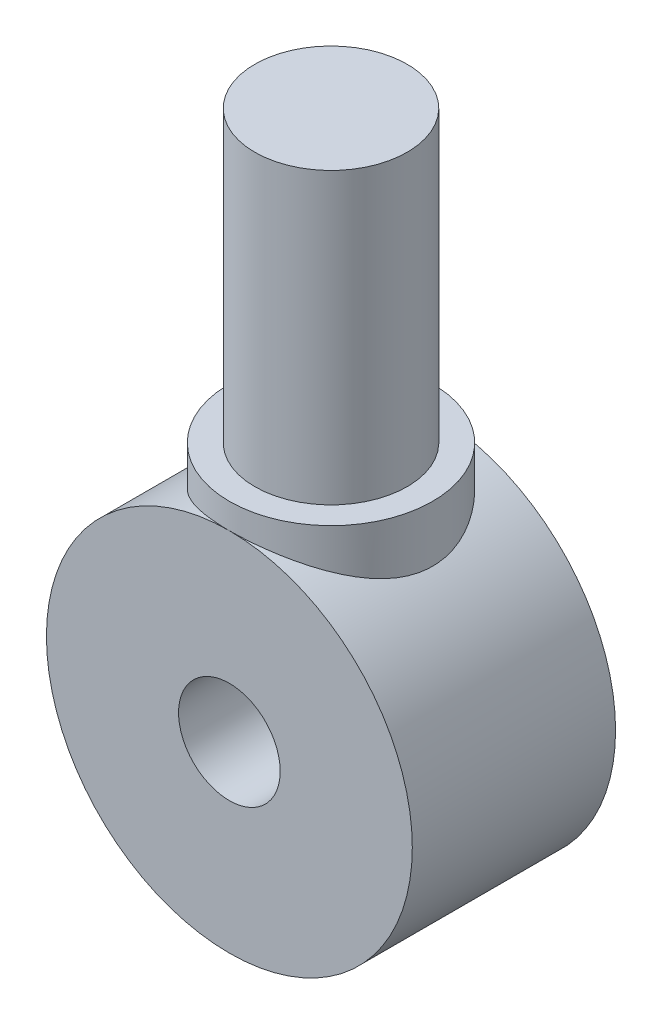
ISO-10303-21;
HEADER;
FILE_DESCRIPTION(('STEP AP214'),'2;1');
FILE_NAME('part.step','',(''),(''),'','','');
FILE_SCHEMA(('AUTOMOTIVE_DESIGN { 1 0 10303 214 1 1 1 1 }'));
ENDSEC;
DATA;
#1=APPLICATION_CONTEXT('core data for automotive mechanical design processes');
#2=APPLICATION_PROTOCOL_DEFINITION('international standard','automotive_design',2000,#1);
#3=PRODUCT_CONTEXT('',#1,'mechanical');
#4=PRODUCT('Part','Part','',(#3));
#5=PRODUCT_RELATED_PRODUCT_CATEGORY('part','',(#4));
#6=PRODUCT_DEFINITION_FORMATION('','',#4);
#7=PRODUCT_DEFINITION_CONTEXT('part definition',#1,'design');
#8=PRODUCT_DEFINITION('design','',#6,#7);
#9=PRODUCT_DEFINITION_SHAPE('','',#8);
#10=(LENGTH_UNIT() NAMED_UNIT(*) SI_UNIT(.MILLI.,.METRE.));
#11=(NAMED_UNIT(*) PLANE_ANGLE_UNIT() SI_UNIT($,.RADIAN.));
#12=(NAMED_UNIT(*) SI_UNIT($,.STERADIAN.) SOLID_ANGLE_UNIT());
#13=UNCERTAINTY_MEASURE_WITH_UNIT(LENGTH_MEASURE(1.E-05),#10,'distance_accuracy_value','');
#14=(GEOMETRIC_REPRESENTATION_CONTEXT(3) GLOBAL_UNCERTAINTY_ASSIGNED_CONTEXT((#13)) GLOBAL_UNIT_ASSIGNED_CONTEXT((#10,
#11,#12)) REPRESENTATION_CONTEXT('',''));
#15=CARTESIAN_POINT('',(0.,0.,0.));
#16=DIRECTION('',(0.,0.,1.));
#17=DIRECTION('',(1.,0.,0.));
#18=AXIS2_PLACEMENT_3D('',#15,#16,#17);
#19=CARTESIAN_POINT('',(-2.8421709430404E-11,49.,10.));
#20=DIRECTION('',(0.,-1.,0.));
#21=DIRECTION('',(0.,0.,-1.));
#22=AXIS2_PLACEMENT_3D('',#19,#20,#21);
#23=CYLINDRICAL_SURFACE('',#22,10.);
#24=CARTESIAN_POINT('',(-2.8421709430404E-11,18.,20.));
#25=CARTESIAN_POINT('',(0.259509797654102,18.0000007102722,20.000000812467));
#26=CARTESIAN_POINT('',(0.519009162390128,17.9943760662111,19.9898873898888));
#27=CARTESIAN_POINT('',(1.03594740531624,17.9720264516023,19.9495737380614));
#28=CARTESIAN_POINT('',(1.29338639169425,17.9553020678101,19.9193745705865));
#29=CARTESIAN_POINT('',(1.80427902694675,17.9111790669649,19.8392809749721));
#30=CARTESIAN_POINT('',(2.05773211439701,17.8837789599726,19.7893837977002));
#31=CARTESIAN_POINT('',(2.55881203678416,17.8189873208177,19.6705113741654));
#32=CARTESIAN_POINT('',(2.80643873505417,17.7815955545391,19.6015356808698));
#33=CARTESIAN_POINT('',(3.29328464049753,17.6978826775575,19.4455999492199));
#34=CARTESIAN_POINT('',(3.53253323431711,17.6515974793146,19.3587121420134));
#35=CARTESIAN_POINT('',(4.00236991282897,17.5510335953474,19.167626799527));
#36=CARTESIAN_POINT('',(4.23295463070263,17.4967518416362,19.0634226186123));
#37=CARTESIAN_POINT('',(4.68416079801589,17.3813939297801,18.8386736953867));
#38=CARTESIAN_POINT('',(4.90478453780072,17.320319344824,18.7181327351922));
#39=CARTESIAN_POINT('',(5.3352406419484,17.1926040945483,18.4615612181676));
#40=CARTESIAN_POINT('',(5.54506899401181,17.1259613835392,18.3255249617498));
#41=CARTESIAN_POINT('',(5.96719881108084,16.9836840607291,18.0289236361891));
#42=CARTESIAN_POINT('',(6.17866274414977,16.9077463725161,17.867311773288));
#43=CARTESIAN_POINT('',(6.58738685671915,16.7527345745777,17.5284011880362));
#44=CARTESIAN_POINT('',(6.78464647694671,16.6736603415456,17.3511018486274));
#45=CARTESIAN_POINT('',(7.16437852397829,16.5140587961387,16.9815427637524));
#46=CARTESIAN_POINT('',(7.34683661827217,16.4335301655436,16.7892688630693));
#47=CARTESIAN_POINT('',(7.69601258924546,16.2729323108613,16.3907420518954));
#48=CARTESIAN_POINT('',(7.86273004751091,16.1928630990393,16.1844887700581));
#49=CARTESIAN_POINT('',(8.19575031023344,16.027092370571,15.7371693818934));
#50=CARTESIAN_POINT('',(8.36029340868685,15.9416440846746,15.4946946578162));
#51=CARTESIAN_POINT('',(8.66822778297759,15.7763234736578,14.9947984673563));
#52=CARTESIAN_POINT('',(8.81161630395452,15.6964518754751,14.7373750603498));
#53=CARTESIAN_POINT('',(9.07579196475879,15.5451970156904,14.2091675991327));
#54=CARTESIAN_POINT('',(9.19660535463417,15.4738039310579,13.9383995309698));
#55=CARTESIAN_POINT('',(9.41441685989797,15.3422609073133,13.3848410198492));
#56=CARTESIAN_POINT('',(9.51142221761271,15.2821075504447,13.1020542637224));
#57=CARTESIAN_POINT('',(9.6624724743574,15.186929316545,12.5870337546879));
#58=CARTESIAN_POINT('',(9.72126151794044,15.1492802473647,12.3566666915175));
#59=CARTESIAN_POINT('',(9.82246710746985,15.0838583829476,11.8909998942951));
#60=CARTESIAN_POINT('',(9.86488672201181,15.0560837367389,11.6557010934692));
#61=CARTESIAN_POINT('',(9.93279850338341,15.0113680958708,11.1818435764788));
#62=CARTESIAN_POINT('',(9.95830449337282,14.9944182547388,10.9432876854268));
#63=CARTESIAN_POINT('',(9.99209361396901,14.971923119818,10.4644109173106));
#64=CARTESIAN_POINT('',(10.0003763839801,14.9663780648068,10.2240900033985));
#65=CARTESIAN_POINT('',(9.99959691597184,14.9668988690882,9.74322869595935));
#66=CARTESIAN_POINT('',(9.99051588063968,14.9729773114825,9.50268834665682));
#67=CARTESIAN_POINT('',(9.95510358311336,14.9965449439875,9.02345134620901));
#68=CARTESIAN_POINT('',(9.92877226334046,15.0140341721857,8.78475470122043));
#69=CARTESIAN_POINT('',(9.85920387229258,15.0598082901169,8.31076591752421));
#70=CARTESIAN_POINT('',(9.81595753668132,15.0880990956596,8.07547571788194));
#71=CARTESIAN_POINT('',(9.71310456306763,15.1545154326564,7.60992887784584));
#72=CARTESIAN_POINT('',(9.65349752743883,15.1926412031358,7.37967235993621));
#73=CARTESIAN_POINT('',(9.51858167643201,15.2775307524342,6.92547215471479));
#74=CARTESIAN_POINT('',(9.44327419115026,15.3242937994901,6.70152793446678));
#75=CARTESIAN_POINT('',(9.27764644907307,15.4251310793876,6.2609206159188));
#76=CARTESIAN_POINT('',(9.18732100870165,15.4792078354121,6.0442600627884));
#77=CARTESIAN_POINT('',(8.89489648895337,15.6502988534358,5.40659003952546));
#78=CARTESIAN_POINT('',(8.67128067525176,15.7762188623536,4.99766428576505));
#79=CARTESIAN_POINT('',(8.13378989892457,16.06073055138,4.15823226478005));
#80=CARTESIAN_POINT('',(7.81136272508216,16.2213792606234,3.7338900790016));
#81=CARTESIAN_POINT('',(7.280831389281,16.4629127288713,3.13996071059065));
#82=CARTESIAN_POINT('',(7.09602179859567,16.5435758466571,2.9489588368636));
#83=CARTESIAN_POINT('',(6.71134773416241,16.7033269650372,2.58188270197782));
#84=CARTESIAN_POINT('',(6.51148091487548,16.7824147177929,2.40581077564865));
#85=CARTESIAN_POINT('',(6.07645293088512,16.9450878306917,2.05248212087251));
#86=CARTESIAN_POINT('',(5.83976997778315,17.0283116394488,1.87692886511049));
#87=CARTESIAN_POINT('',(5.35041639697349,17.1883470069273,1.54658993639136));
#88=CARTESIAN_POINT('',(5.09775240232394,17.2651611957056,1.39179572939309));
#89=CARTESIAN_POINT('',(4.57782513775163,17.4102364123405,1.10439899012728));
#90=CARTESIAN_POINT('',(4.3105654799826,17.4784995427736,0.971790999901493));
#91=CARTESIAN_POINT('',(3.7631612596905,17.6044726309532,0.730260029251053));
#92=CARTESIAN_POINT('',(3.48301827031503,17.6621838729019,0.621334166322307));
#93=CARTESIAN_POINT('',(2.93224232352138,17.7616054828897,0.435464242087173));
#94=CARTESIAN_POINT('',(2.66234198119715,17.8041598600932,0.356800959608339));
#95=CARTESIAN_POINT('',(2.11533454362633,17.8774013028712,0.222235958576381));
#96=CARTESIAN_POINT('',(1.83822773137743,17.9080888337074,0.166333347644555));
#97=CARTESIAN_POINT('',(1.27937632372795,17.9566646855724,0.0781472970614078));
#98=CARTESIAN_POINT('',(0.99763530024307,17.9745624314263,0.0458464648037023));
#99=CARTESIAN_POINT('',(0.431908116440638,17.9970431155266,0.00530881616424839));
#100=CARTESIAN_POINT('',(0.147922179718826,18.0016273634661,-0.00293036724234118));
#101=CARTESIAN_POINT('',(-0.387372689641085,17.9975905356525,0.00433807801176051));
#102=CARTESIAN_POINT('',(-0.638732475066286,17.9904090591949,0.0172568516059827));
#103=CARTESIAN_POINT('',(-1.13923744243393,17.965658898456,0.0619293353281062));
#104=CARTESIAN_POINT('',(-1.38838282485247,17.9480911643975,0.0936813224347345));
#105=CARTESIAN_POINT('',(-1.88269464896605,17.9029904396076,0.175630596125419));
#106=CARTESIAN_POINT('',(-2.12786107526206,17.8754574103189,0.22582795407751));
#107=CARTESIAN_POINT('',(-2.61259195977842,17.8110681283651,0.344089569940498));
#108=CARTESIAN_POINT('',(-2.85215623680782,17.7742115746027,0.412154404873198));
#109=CARTESIAN_POINT('',(-3.32328937498986,17.6921650703605,0.565125694772589));
#110=CARTESIAN_POINT('',(-3.55488607696709,17.6470086072361,0.649964572660426));
#111=CARTESIAN_POINT('',(-4.00991543458042,17.5492096285834,0.835884674375491));
#112=CARTESIAN_POINT('',(-4.23334515299604,17.4965644524293,0.936971672578497));
#113=CARTESIAN_POINT('',(-4.67086597309818,17.3848779524741,1.15451012439003));
#114=CARTESIAN_POINT('',(-4.88495872269057,17.3258377638057,1.27095885204562));
#115=CARTESIAN_POINT('',(-5.30303939984111,17.2024795173545,1.51844283558604));
#116=CARTESIAN_POINT('',(-5.50702365006167,17.1381595611406,1.649483344288));
#117=CARTESIAN_POINT('',(-5.92447378662494,16.9986435596655,1.93949954201021));
#118=CARTESIAN_POINT('',(-6.13676115469354,16.9230089990413,2.0999620769167));
#119=CARTESIAN_POINT('',(-6.54728249332505,16.7684593090441,2.43669298220354));
#120=CARTESIAN_POINT('',(-6.74550996925776,16.6895426899609,2.61296857299198));
#121=CARTESIAN_POINT('',(-7.12720629056752,16.5301464055559,2.98051402609291));
#122=CARTESIAN_POINT('',(-7.31066266682559,16.4496654894062,3.17179629297905));
#123=CARTESIAN_POINT('',(-7.66189018484219,16.2890373117839,3.56838994112737));
#124=CARTESIAN_POINT('',(-7.82966087464044,16.2088900599891,3.7737017263349));
#125=CARTESIAN_POINT('',(-8.16485508056742,16.0428661853461,4.21895991602457));
#126=CARTESIAN_POINT('',(-8.33053655192119,15.9572271194547,4.46031091717211));
#127=CARTESIAN_POINT('',(-8.64085194427719,15.7913472188891,4.95800809571189));
#128=CARTESIAN_POINT('',(-8.78548310661268,15.7111070924915,5.21435623233523));
#129=CARTESIAN_POINT('',(-9.05225957771789,15.5589254616439,5.74048284816611));
#130=CARTESIAN_POINT('',(-9.17443075316143,15.4869744469311,6.01024541735409));
#131=CARTESIAN_POINT('',(-9.39508184572159,15.3541215425453,6.56188800618016));
#132=CARTESIAN_POINT('',(-9.49356886630698,15.293216341308,6.84376436261998));
#133=CARTESIAN_POINT('',(-9.64753162195973,15.1964331296048,7.35777394614404));
#134=CARTESIAN_POINT('',(-9.70769364246285,15.1579846143108,7.58802882520739));
#135=CARTESIAN_POINT('',(-9.81164458256372,15.0909068576024,8.05359587322438));
#136=CARTESIAN_POINT('',(-9.85543657757459,15.0622757718853,8.28890708345925));
#137=CARTESIAN_POINT('',(-9.92607733036323,15.0158177099104,8.76292271218389));
#138=CARTESIAN_POINT('',(-9.95294008479908,14.9979818089577,9.00162416029167));
#139=CARTESIAN_POINT('',(-9.98941092070105,14.9737154468049,9.48093181255457));
#140=CARTESIAN_POINT('',(-9.99901865955796,14.9672852120714,9.72153805443529));
#141=CARTESIAN_POINT('',(-10.0008395226844,14.9660686376268,10.203144077808));
#142=CARTESIAN_POINT('',(-9.99303110800732,14.9712967160105,10.444143977858));
#143=CARTESIAN_POINT('',(-9.9600895002147,14.9932319471974,10.9244238852993));
#144=CARTESIAN_POINT('',(-9.93495624870267,15.0099391386929,11.1637038868907));
#145=CARTESIAN_POINT('',(-9.86769676000021,15.0542411063912,11.6389616017616));
#146=CARTESIAN_POINT('',(-9.82556136327131,15.0818417510307,11.8749374639925));
#147=CARTESIAN_POINT('',(-9.72483436405101,15.1469859951734,12.3419366043099));
#148=CARTESIAN_POINT('',(-9.66624238642568,15.1845298213338,12.5729597693685));
#149=CARTESIAN_POINT('',(-9.53347346786963,15.2682354265095,13.0280144089675));
#150=CARTESIAN_POINT('',(-9.45934886318597,15.3143682087722,13.2520665318393));
#151=CARTESIAN_POINT('',(-9.29608638901055,15.4140168529221,13.6929783584916));
#152=CARTESIAN_POINT('',(-9.20694334175747,15.4675352599238,13.9098355507785));
#153=CARTESIAN_POINT('',(-8.91806258461549,15.6370729690554,14.5482126849042));
#154=CARTESIAN_POINT('',(-8.69680496028133,15.7621197002441,14.9577693782606));
#155=CARTESIAN_POINT('',(-8.16470411804419,16.044973788278,15.798363505256));
#156=CARTESIAN_POINT('',(-7.84538537791856,16.2048783327972,16.2233375552231));
#157=CARTESIAN_POINT('',(-7.31961102254212,16.4456892288004,16.8186186047556));
#158=CARTESIAN_POINT('',(-7.1364026432305,16.5261776519048,17.0101399982271));
#159=CARTESIAN_POINT('',(-6.75495823210603,16.6857192077431,17.3784003385362));
#160=CARTESIAN_POINT('',(-6.55671984488744,16.7647721130959,17.5551369592337));
#161=CARTESIAN_POINT('',(-6.12457000084719,16.9277406266202,17.9104914334329));
#162=CARTESIAN_POINT('',(-5.88909560974992,17.0113009301372,18.087375327655));
#163=CARTESIAN_POINT('',(-5.40207803555387,17.1721658006588,18.4204833384384));
#164=CARTESIAN_POINT('',(-5.15054145711906,17.2494729096705,18.576715866602));
#165=CARTESIAN_POINT('',(-4.63278582507347,17.3956783717282,18.8670941339475));
#166=CARTESIAN_POINT('',(-4.3665713832927,17.4645793443933,19.0012467585009));
#167=CARTESIAN_POINT('',(-3.82113416394045,17.5919675175487,19.2459853023426));
#168=CARTESIAN_POINT('',(-3.54191321854648,17.650456179219,19.356574528758));
#169=CARTESIAN_POINT('',(-2.99826699602189,17.7504861844775,19.5438693236877));
#170=CARTESIAN_POINT('',(-2.73477748664091,17.7930800553635,19.6227308849424));
#171=CARTESIAN_POINT('',(-2.20069535787028,17.8669971712002,19.7587321094807));
#172=CARTESIAN_POINT('',(-1.93010317400921,17.8983211054874,19.8158731013358));
#173=CARTESIAN_POINT('',(-1.3841766585014,17.9487924370695,19.9076040072548));
#174=CARTESIAN_POINT('',(-1.10884553070965,17.9679477528732,19.9422085868521));
#175=CARTESIAN_POINT('',(-0.555672198245068,17.9935508356449,19.9884055715639));
#176=CARTESIAN_POINT('',(-0.277830120142715,17.9999992395855,19.9999991301762));
#177=CARTESIAN_POINT('',(-2.8421709430404E-11,18.,20.));
#178=B_SPLINE_CURVE_WITH_KNOTS('',3,(#24,#25,#26,#27,#28,#29,#30,#31,#32,#33,#34,#35,#36,#37,
#38,#39,#40,#41,#42,#43,#44,#45,#46,#47,#48,#49,#50,#51,#52,#53,#54,#55,#56,#57,#58,#59,#60,#61,
#62,#63,#64,#65,#66,#67,#68,#69,#70,#71,#72,#73,#74,#75,#76,#77,#78,#79,#80,#81,#82,#83,#84,#85,
#86,#87,#88,#89,#90,#91,#92,#93,#94,#95,#96,#97,#98,#99,#100,#101,#102,#103,#104,#105,#106,#107,
#108,#109,#110,#111,#112,#113,#114,#115,#116,#117,#118,#119,#120,#121,#122,#123,#124,#125,#126,
#127,#128,#129,#130,#131,#132,#133,#134,#135,#136,#137,#138,#139,#140,#141,#142,#143,#144,#145,
#146,#147,#148,#149,#150,#151,#152,#153,#154,#155,#156,#157,#158,#159,#160,#161,#162,#163,#164,
#165,#166,#167,#168,#169,#170,#171,#172,#173,#174,#175,#176,#177),.UNSPECIFIED.,.T.,.F.,(4,2,2,
2,2,2,2,2,2,2,2,2,2,2,2,2,2,2,2,2,2,2,2,2,2,2,2,2,2,2,2,2,2,2,2,2,2,2,2,2,2,2,2,2,2,2,2,2,2,2,2,
2,2,2,2,2,2,2,2,2,2,2,2,2,2,2,2,2,2,2,2,2,2,2,2,2,4),(0.,0.778255474043375,1.55646981115163,
2.33479279735691,3.11313402215566,3.88839589327673,4.66395598251704,5.43933682811382,
6.21500380634171,7.04446005979805,7.87394895397577,8.7042316967023,9.53453650360271,
10.449118550086,11.3638195933268,12.2774503247451,13.1908027872198,13.9121916932728,
14.6334453027674,15.3541087175307,16.0747872203843,16.7962463406804,17.5177078691054,
18.2395650958128,18.9614398679118,19.6832535097187,20.4053168108749,21.8487239904814,
23.5114798636158,24.3440633799025,25.1767768610904,26.0942463978318,27.0113375991872,
27.9282028571539,28.844956454997,29.6967531774593,30.5485165002713,31.3996515074615,
32.2507027828345,33.0051701986153,33.7595685999957,34.5139699202928,35.268395606625,
36.0198417152853,36.7715554712351,37.5231360138761,38.2749879940166,39.1040737535491,
39.9335400282889,40.7636993170671,41.5938825183133,42.5078062840956,43.4218497129821,
44.3348337717306,45.2475436613161,45.9700075203481,46.6923355828396,47.4140656569952,
48.135810061397,48.8584475581085,49.5810874906122,50.3041172506432,51.027163493747,
51.7478115614731,52.4687085903058,53.9097743107769,55.5679987138163,56.3983241901496,
57.2287800597638,58.14603135938,59.0629078902983,59.9794979595555,60.8959593003676,
61.7297923106023,62.5635743099636,63.3968131834504,64.230010287236),.UNSPECIFIED.);
#179=CARTESIAN_POINT('',(-2.8421709430404E-11,18.,0.));
#180=VERTEX_POINT('',#179);
#181=CARTESIAN_POINT('',(-2.8421709430404E-11,18.,20.));
#182=VERTEX_POINT('',#181);
#183=EDGE_CURVE('E41',#180,#182,#178,.T.);
#184=ORIENTED_EDGE('',*,*,#183,.T.);
#185=EDGE_CURVE('E11',#182,#180,#178,.T.);
#186=ORIENTED_EDGE('',*,*,#185,.T.);
#187=EDGE_LOOP('',(#184,#186));
#188=FACE_BOUND('',#187,.T.);
#189=CARTESIAN_POINT('',(-2.8421709430404E-11,20.5,10.));
#190=DIRECTION('',(0.,1.,0.));
#191=DIRECTION('',(0.,0.,1.));
#192=AXIS2_PLACEMENT_3D('',#189,#190,#191);
#193=CIRCLE('',#192,10.);
#194=CARTESIAN_POINT('',(-2.8421709430404E-11,20.5,20.));
#195=VERTEX_POINT('',#194);
#196=EDGE_CURVE('E36',#195,#195,#193,.T.);
#197=ORIENTED_EDGE('',*,*,#196,.F.);
#198=EDGE_LOOP('',(#197));
#199=FACE_BOUND('',#198,.T.);
#200=ADVANCED_FACE('F31',(#188,#199),#23,.T.);
#201=CARTESIAN_POINT('',(0.,0.,20.));
#202=DIRECTION('',(0.,0.,-1.));
#203=DIRECTION('',(-1.,0.,0.));
#204=AXIS2_PLACEMENT_3D('',#201,#202,#203);
#205=CYLINDRICAL_SURFACE('',#204,18.);
#206=ORIENTED_EDGE('',*,*,#185,.F.);
#207=CARTESIAN_POINT('',(0.,0.,20.));
#208=DIRECTION('',(0.,0.,1.));
#209=DIRECTION('',(1.,0.,0.));
#210=AXIS2_PLACEMENT_3D('',#207,#208,#209);
#211=CIRCLE('',#210,18.);
#212=EDGE_CURVE('E50',#182,#182,#211,.T.);
#213=ORIENTED_EDGE('',*,*,#212,.F.);
#214=ORIENTED_EDGE('',*,*,#183,.F.);
#215=CARTESIAN_POINT('',(0.,0.,0.));
#216=DIRECTION('',(0.,0.,1.));
#217=DIRECTION('',(1.,0.,0.));
#218=AXIS2_PLACEMENT_3D('',#215,#216,#217);
#219=CIRCLE('',#218,18.);
#220=EDGE_CURVE('E52',#180,#180,#219,.T.);
#221=ORIENTED_EDGE('',*,*,#220,.T.);
#222=EDGE_LOOP('',(#206,#213,#214,#221));
#223=FACE_BOUND('',#222,.T.);
#224=ADVANCED_FACE('F33',(#223),#205,.T.);
#225=CARTESIAN_POINT('',(0.,0.,20.));
#226=DIRECTION('',(0.,0.,1.));
#227=DIRECTION('',(1.,0.,0.));
#228=AXIS2_PLACEMENT_3D('',#225,#226,#227);
#229=PLANE('',#228);
#230=ORIENTED_EDGE('',*,*,#212,.T.);
#231=EDGE_LOOP('',(#230));
#232=FACE_BOUND('',#231,.T.);
#233=CARTESIAN_POINT('',(0.,0.,20.));
#234=DIRECTION('',(0.,0.,1.));
#235=DIRECTION('',(1.,0.,0.));
#236=AXIS2_PLACEMENT_3D('',#233,#234,#235);
#237=CIRCLE('',#236,5.);
#238=CARTESIAN_POINT('',(5.,0.,20.));
#239=VERTEX_POINT('',#238);
#240=EDGE_CURVE('E54',#239,#239,#237,.T.);
#241=ORIENTED_EDGE('',*,*,#240,.F.);
#242=EDGE_LOOP('',(#241));
#243=FACE_BOUND('',#242,.T.);
#244=ADVANCED_FACE('F75',(#232,#243),#229,.T.);
#245=CARTESIAN_POINT('',(0.,0.,0.));
#246=DIRECTION('',(0.,0.,1.));
#247=DIRECTION('',(1.,0.,0.));
#248=AXIS2_PLACEMENT_3D('',#245,#246,#247);
#249=PLANE('',#248);
#250=ORIENTED_EDGE('',*,*,#220,.F.);
#251=EDGE_LOOP('',(#250));
#252=FACE_BOUND('',#251,.T.);
#253=CARTESIAN_POINT('',(0.,0.,0.));
#254=DIRECTION('',(0.,0.,1.));
#255=DIRECTION('',(1.,0.,0.));
#256=AXIS2_PLACEMENT_3D('',#253,#254,#255);
#257=CIRCLE('',#256,5.);
#258=CARTESIAN_POINT('',(5.,0.,0.));
#259=VERTEX_POINT('',#258);
#260=EDGE_CURVE('E57',#259,#259,#257,.T.);
#261=ORIENTED_EDGE('',*,*,#260,.T.);
#262=EDGE_LOOP('',(#261));
#263=FACE_BOUND('',#262,.T.);
#264=ADVANCED_FACE('F73',(#252,#263),#249,.F.);
#265=CARTESIAN_POINT('',(0.,0.,20.));
#266=DIRECTION('',(0.,0.,-1.));
#267=DIRECTION('',(-1.,0.,0.));
#268=AXIS2_PLACEMENT_3D('',#265,#266,#267);
#269=CYLINDRICAL_SURFACE('',#268,5.);
#270=ORIENTED_EDGE('',*,*,#240,.T.);
#271=EDGE_LOOP('',(#270));
#272=FACE_BOUND('',#271,.T.);
#273=ORIENTED_EDGE('',*,*,#260,.F.);
#274=EDGE_LOOP('',(#273));
#275=FACE_BOUND('',#274,.T.);
#276=ADVANCED_FACE('F69',(#272,#275),#269,.F.);
#277=CARTESIAN_POINT('',(-2.8421709430404E-11,20.5,10.));
#278=DIRECTION('',(0.,1.,0.));
#279=DIRECTION('',(0.,0.,1.));
#280=AXIS2_PLACEMENT_3D('',#277,#278,#279);
#281=PLANE('',#280);
#282=CARTESIAN_POINT('',(-2.8421709430404E-11,20.5,10.));
#283=DIRECTION('',(0.,1.,0.));
#284=DIRECTION('',(0.,0.,1.));
#285=AXIS2_PLACEMENT_3D('',#282,#283,#284);
#286=CIRCLE('',#285,7.5);
#287=CARTESIAN_POINT('',(-2.8421709430404E-11,20.5,17.5));
#288=VERTEX_POINT('',#287);
#289=EDGE_CURVE('E88',#288,#288,#286,.T.);
#290=ORIENTED_EDGE('',*,*,#289,.F.);
#291=EDGE_LOOP('',(#290));
#292=FACE_BOUND('',#291,.T.);
#293=ORIENTED_EDGE('',*,*,#196,.T.);
#294=EDGE_LOOP('',(#293));
#295=FACE_BOUND('',#294,.T.);
#296=ADVANCED_FACE('F72',(#292,#295),#281,.T.);
#297=CARTESIAN_POINT('',(-2.8421709430404E-11,20.5,10.));
#298=DIRECTION('',(0.,1.,0.));
#299=DIRECTION('',(0.,0.,1.));
#300=AXIS2_PLACEMENT_3D('',#297,#298,#299);
#301=CYLINDRICAL_SURFACE('',#300,7.5);
#302=CARTESIAN_POINT('',(-2.8421709430404E-11,49.,10.));
#303=DIRECTION('',(0.,1.,0.));
#304=DIRECTION('',(0.,0.,1.));
#305=AXIS2_PLACEMENT_3D('',#302,#303,#304);
#306=CIRCLE('',#305,7.5);
#307=CARTESIAN_POINT('',(-2.8421709430404E-11,49.,17.5));
#308=VERTEX_POINT('',#307);
#309=EDGE_CURVE('E92',#308,#308,#306,.T.);
#310=CARTESIAN_POINT('',(-2.8421709430404E-11,20.5,17.5));
#311=CARTESIAN_POINT('',(-2.8421709430404E-11,20.796875,17.5));
#312=CARTESIAN_POINT('',(-2.8421709430404E-11,21.09375,17.5));
#313=CARTESIAN_POINT('',(-2.8421709430404E-11,21.6875,17.5));
#314=CARTESIAN_POINT('',(-2.8421709430404E-11,21.984375,17.5));
#315=CARTESIAN_POINT('',(-2.8421709430404E-11,22.578125,17.5));
#316=CARTESIAN_POINT('',(-2.8421709430404E-11,22.875,17.5));
#317=CARTESIAN_POINT('',(-2.8421709430404E-11,23.46875,17.5));
#318=CARTESIAN_POINT('',(-2.8421709430404E-11,23.765625,17.5));
#319=CARTESIAN_POINT('',(-2.8421709430404E-11,24.359375,17.5));
#320=CARTESIAN_POINT('',(-2.8421709430404E-11,24.65625,17.5));
#321=CARTESIAN_POINT('',(-2.8421709430404E-11,25.25,17.5));
#322=CARTESIAN_POINT('',(-2.8421709430404E-11,25.546875,17.5));
#323=CARTESIAN_POINT('',(-2.8421709430404E-11,26.140625,17.5));
#324=CARTESIAN_POINT('',(-2.8421709430404E-11,26.4375,17.5));
#325=CARTESIAN_POINT('',(-2.8421709430404E-11,27.03125,17.5));
#326=CARTESIAN_POINT('',(-2.8421709430404E-11,27.328125,17.5));
#327=CARTESIAN_POINT('',(-2.8421709430404E-11,27.921875,17.5));
#328=CARTESIAN_POINT('',(-2.8421709430404E-11,28.21875,17.5));
#329=CARTESIAN_POINT('',(-2.8421709430404E-11,28.8125,17.5));
#330=CARTESIAN_POINT('',(-2.8421709430404E-11,29.109375,17.5));
#331=CARTESIAN_POINT('',(-2.8421709430404E-11,29.703125,17.5));
#332=CARTESIAN_POINT('',(-2.8421709430404E-11,30.,17.5));
#333=CARTESIAN_POINT('',(-2.8421709430404E-11,30.59375,17.5));
#334=CARTESIAN_POINT('',(-2.8421709430404E-11,30.890625,17.5));
#335=CARTESIAN_POINT('',(-2.8421709430404E-11,31.484375,17.5));
#336=CARTESIAN_POINT('',(-2.8421709430404E-11,31.78125,17.5));
#337=CARTESIAN_POINT('',(-2.8421709430404E-11,32.375,17.5));
#338=CARTESIAN_POINT('',(-2.8421709430404E-11,32.671875,17.5));
#339=CARTESIAN_POINT('',(-2.8421709430404E-11,33.265625,17.5));
#340=CARTESIAN_POINT('',(-2.8421709430404E-11,33.5625,17.5));
#341=CARTESIAN_POINT('',(-2.8421709430404E-11,34.15625,17.5));
#342=CARTESIAN_POINT('',(-2.8421709430404E-11,34.453125,17.5));
#343=CARTESIAN_POINT('',(-2.8421709430404E-11,35.046875,17.5));
#344=CARTESIAN_POINT('',(-2.8421709430404E-11,35.34375,17.5));
#345=CARTESIAN_POINT('',(-2.8421709430404E-11,35.9375,17.5));
#346=CARTESIAN_POINT('',(-2.8421709430404E-11,36.234375,17.5));
#347=CARTESIAN_POINT('',(-2.8421709430404E-11,36.828125,17.5));
#348=CARTESIAN_POINT('',(-2.8421709430404E-11,37.125,17.5));
#349=CARTESIAN_POINT('',(-2.8421709430404E-11,37.71875,17.5));
#350=CARTESIAN_POINT('',(-2.8421709430404E-11,38.015625,17.5));
#351=CARTESIAN_POINT('',(-2.8421709430404E-11,38.609375,17.5));
#352=CARTESIAN_POINT('',(-2.8421709430404E-11,38.90625,17.5));
#353=CARTESIAN_POINT('',(-2.8421709430404E-11,39.5,17.5));
#354=CARTESIAN_POINT('',(-2.8421709430404E-11,39.796875,17.5));
#355=CARTESIAN_POINT('',(-2.8421709430404E-11,40.390625,17.5));
#356=CARTESIAN_POINT('',(-2.8421709430404E-11,40.6875,17.5));
#357=CARTESIAN_POINT('',(-2.8421709430404E-11,41.28125,17.5));
#358=CARTESIAN_POINT('',(-2.8421709430404E-11,41.578125,17.5));
#359=CARTESIAN_POINT('',(-2.8421709430404E-11,42.171875,17.5));
#360=CARTESIAN_POINT('',(-2.8421709430404E-11,42.46875,17.5));
#361=CARTESIAN_POINT('',(-2.8421709430404E-11,43.0625,17.5));
#362=CARTESIAN_POINT('',(-2.8421709430404E-11,43.359375,17.5));
#363=CARTESIAN_POINT('',(-2.8421709430404E-11,43.953125,17.5));
#364=CARTESIAN_POINT('',(-2.8421709430404E-11,44.25,17.5));
#365=CARTESIAN_POINT('',(-2.8421709430404E-11,44.84375,17.5));
#366=CARTESIAN_POINT('',(-2.8421709430404E-11,45.140625,17.5));
#367=CARTESIAN_POINT('',(-2.8421709430404E-11,45.734375,17.5));
#368=CARTESIAN_POINT('',(-2.8421709430404E-11,46.03125,17.5));
#369=CARTESIAN_POINT('',(-2.8421709430404E-11,46.625,17.5));
#370=CARTESIAN_POINT('',(-2.8421709430404E-11,46.921875,17.5));
#371=CARTESIAN_POINT('',(-2.8421709430404E-11,47.515625,17.5));
#372=CARTESIAN_POINT('',(-2.8421709430404E-11,47.8125,17.5));
#373=CARTESIAN_POINT('',(-2.8421709430404E-11,48.40625,17.5));
#374=CARTESIAN_POINT('',(-2.8421709430404E-11,48.703125,17.5));
#375=CARTESIAN_POINT('',(-2.8421709430404E-11,49.,17.5));
#376=B_SPLINE_CURVE_WITH_KNOTS('',3,(#310,#311,#312,#313,#314,#315,#316,#317,#318,#319,#320,
#321,#322,#323,#324,#325,#326,#327,#328,#329,#330,#331,#332,#333,#334,#335,#336,#337,#338,#339,
#340,#341,#342,#343,#344,#345,#346,#347,#348,#349,#350,#351,#352,#353,#354,#355,#356,#357,#358,
#359,#360,#361,#362,#363,#364,#365,#366,#367,#368,#369,#370,#371,#372,#373,#374,#375),
.UNSPECIFIED.,.F.,.F.,(4,2,2,2,2,2,2,2,2,2,2,2,2,2,2,2,2,2,2,2,2,2,2,2,2,2,2,2,2,2,2,2,4),(0.,
0.890625000000003,1.78125,2.671875,3.5625,4.453125,5.34375,6.234375,7.125,8.015625,8.90625,
9.796875,10.6875,11.578125,12.46875,13.359375,14.25,15.140625,16.03125,16.921875,17.8125,
18.703125,19.59375,20.484375,21.375,22.265625,23.15625,24.046875,24.9375,25.828125,26.71875,
27.609375,28.5),.UNSPECIFIED.);
#377=EDGE_CURVE('BSEAM101',#288,#308,#376,.T.);
#378=ORIENTED_EDGE('',*,*,#289,.T.);
#379=ORIENTED_EDGE('',*,*,#309,.F.);
#380=ORIENTED_EDGE('',*,*,#377,.T.);
#381=ORIENTED_EDGE('',*,*,#377,.F.);
#382=EDGE_LOOP('',(#378,#380,#379,#381));
#383=FACE_BOUND('',#382,.T.);
#384=ADVANCED_FACE('F101',(#383),#301,.T.);
#385=CARTESIAN_POINT('',(-2.8421709430404E-11,49.,10.));
#386=DIRECTION('',(0.,1.,0.));
#387=DIRECTION('',(0.,0.,1.));
#388=AXIS2_PLACEMENT_3D('',#385,#386,#387);
#389=PLANE('',#388);
#390=ORIENTED_EDGE('',*,*,#309,.T.);
#391=EDGE_LOOP('',(#390));
#392=FACE_BOUND('',#391,.T.);
#393=ADVANCED_FACE('F67',(#392),#389,.T.);
#394=CLOSED_SHELL('',(#200,#224,#244,#264,#276,#296,#384,#393));
#395=MANIFOLD_SOLID_BREP('B2',#394);
#396=ADVANCED_BREP_SHAPE_REPRESENTATION('',(#18,#395),#14);
#397=SHAPE_DEFINITION_REPRESENTATION(#9,#396);
ENDSEC;
END-ISO-10303-21;
